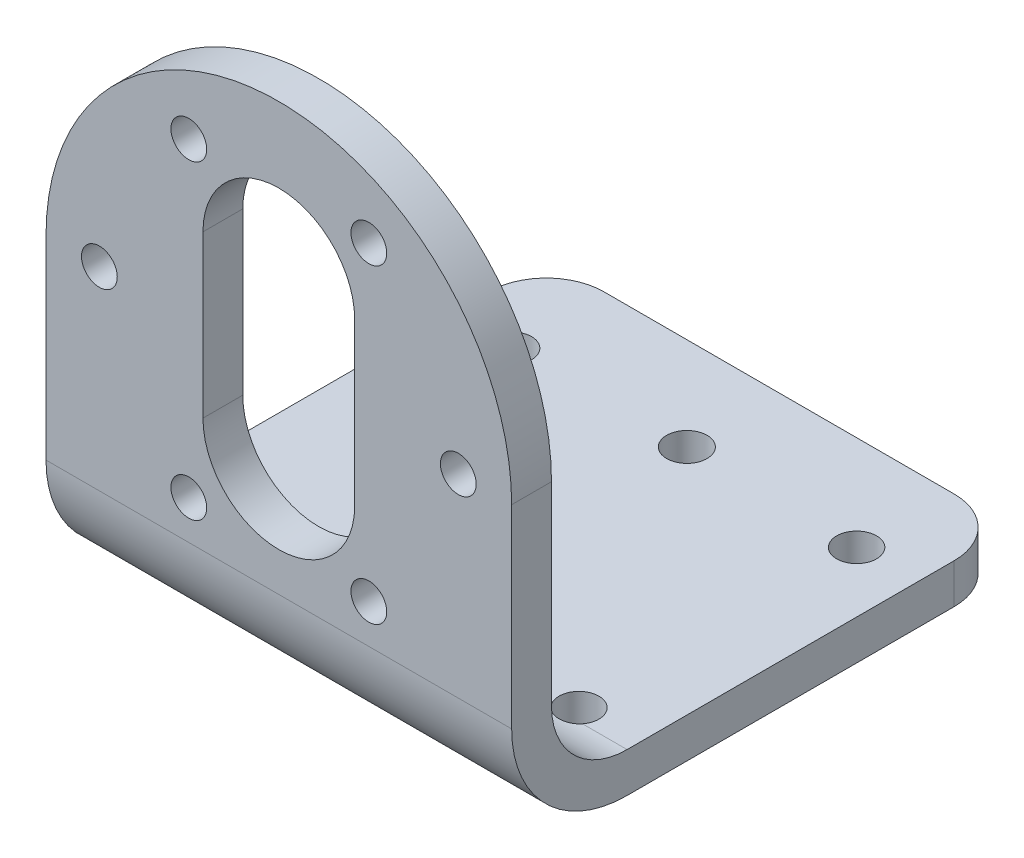
ISO-10303-21;
HEADER;
FILE_DESCRIPTION(('STEP AP214'),'2;1');
FILE_NAME('part.step','',(''),(''),'','','');
FILE_SCHEMA(('AUTOMOTIVE_DESIGN { 1 0 10303 214 1 1 1 1 }'));
ENDSEC;
DATA;
#1=APPLICATION_CONTEXT('core data for automotive mechanical design processes');
#2=APPLICATION_PROTOCOL_DEFINITION('international standard','automotive_design',2000,#1);
#3=PRODUCT_CONTEXT('',#1,'mechanical');
#4=PRODUCT('Part','Part','',(#3));
#5=PRODUCT_RELATED_PRODUCT_CATEGORY('part','',(#4));
#6=PRODUCT_DEFINITION_FORMATION('','',#4);
#7=PRODUCT_DEFINITION_CONTEXT('part definition',#1,'design');
#8=PRODUCT_DEFINITION('design','',#6,#7);
#9=PRODUCT_DEFINITION_SHAPE('','',#8);
#10=(LENGTH_UNIT() NAMED_UNIT(*) SI_UNIT(.MILLI.,.METRE.));
#11=(NAMED_UNIT(*) PLANE_ANGLE_UNIT() SI_UNIT($,.RADIAN.));
#12=(NAMED_UNIT(*) SI_UNIT($,.STERADIAN.) SOLID_ANGLE_UNIT());
#13=UNCERTAINTY_MEASURE_WITH_UNIT(LENGTH_MEASURE(1.E-05),#10,'distance_accuracy_value','');
#14=(GEOMETRIC_REPRESENTATION_CONTEXT(3) GLOBAL_UNCERTAINTY_ASSIGNED_CONTEXT((#13)) GLOBAL_UNIT_ASSIGNED_CONTEXT((#10,
#11,#12)) REPRESENTATION_CONTEXT('',''));
#15=CARTESIAN_POINT('',(0.,0.,0.));
#16=DIRECTION('',(0.,0.,1.));
#17=DIRECTION('',(1.,0.,0.));
#18=AXIS2_PLACEMENT_3D('',#15,#16,#17);
#19=CARTESIAN_POINT('',(-47.1412127925836,47.,50.783023222912));
#20=DIRECTION('',(0.,0.,-1.));
#21=DIRECTION('',(-1.,0.,0.));
#22=AXIS2_PLACEMENT_3D('',#19,#20,#21);
#23=PLANE('',#22);
#24=CARTESIAN_POINT('',(-19.1662127925836,13.3727697016443,50.783023222912));
#25=DIRECTION('',(0.,0.,1.));
#26=DIRECTION('',(1.,0.,0.));
#27=AXIS2_PLACEMENT_3D('',#24,#25,#26);
#28=CIRCLE('',#27,1.55);
#29=CARTESIAN_POINT('',(-17.6162127925836,13.3727697016443,50.783023222912));
#30=VERTEX_POINT('',#29);
#31=EDGE_CURVE('E513',#30,#30,#28,.F.);
#32=ORIENTED_EDGE('',*,*,#31,.T.);
#33=EDGE_LOOP('',(#32));
#34=FACE_BOUND('',#33,.T.);
#35=CARTESIAN_POINT('',(-42.5162127925836,26.825,50.783023222912));
#36=DIRECTION('',(0.,0.,1.));
#37=DIRECTION('',(1.,0.,0.));
#38=AXIS2_PLACEMENT_3D('',#35,#36,#37);
#39=CIRCLE('',#38,1.54999999999999);
#40=CARTESIAN_POINT('',(-40.9662127925836,26.825,50.783023222912));
#41=VERTEX_POINT('',#40);
#42=EDGE_CURVE('E521',#41,#41,#39,.T.);
#43=ORIENTED_EDGE('',*,*,#42,.F.);
#44=EDGE_LOOP('',(#43));
#45=FACE_BOUND('',#44,.T.);
#46=CARTESIAN_POINT('',(-19.1662127925836,40.2772302983557,50.783023222912));
#47=DIRECTION('',(0.,0.,1.));
#48=DIRECTION('',(1.,0.,0.));
#49=AXIS2_PLACEMENT_3D('',#46,#47,#48);
#50=CIRCLE('',#49,1.55);
#51=CARTESIAN_POINT('',(-17.6162127925836,40.2772302983557,50.783023222912));
#52=VERTEX_POINT('',#51);
#53=EDGE_CURVE('E505',#52,#52,#50,.T.);
#54=ORIENTED_EDGE('',*,*,#53,.F.);
#55=EDGE_LOOP('',(#54));
#56=FACE_BOUND('',#55,.T.);
#57=CARTESIAN_POINT('',(-34.7662127925836,13.3727697016443,50.783023222912));
#58=DIRECTION('',(0.,0.,1.));
#59=DIRECTION('',(1.,0.,0.));
#60=AXIS2_PLACEMENT_3D('',#57,#58,#59);
#61=CIRCLE('',#60,1.55);
#62=CARTESIAN_POINT('',(-33.2162127925836,13.3727697016443,50.783023222912));
#63=VERTEX_POINT('',#62);
#64=EDGE_CURVE('E296',#63,#63,#61,.F.);
#65=ORIENTED_EDGE('',*,*,#64,.T.);
#66=EDGE_LOOP('',(#65));
#67=FACE_BOUND('',#66,.T.);
#68=CARTESIAN_POINT('',(-26.9662127925836,19.945,50.783023222912));
#69=DIRECTION('',(0.,0.,1.));
#70=DIRECTION('',(1.,0.,0.));
#71=AXIS2_PLACEMENT_3D('',#68,#69,#70);
#72=CIRCLE('',#71,6.575);
#73=CARTESIAN_POINT('',(-33.5412127925836,19.945,50.783023222912));
#74=VERTEX_POINT('',#73);
#75=CARTESIAN_POINT('',(-20.3912127925836,19.945,50.783023222912));
#76=VERTEX_POINT('',#75);
#77=EDGE_CURVE('E188',#74,#76,#72,.T.);
#78=ORIENTED_EDGE('',*,*,#77,.F.);
#79=DIRECTION('',(0.,-1.,0.));
#80=VECTOR('',#79,1.);
#81=CARTESIAN_POINT('',(-33.5412127925836,0.,50.783023222912));
#82=LINE('',#81,#80);
#83=CARTESIAN_POINT('',(-33.5412127925836,33.925,50.783023222912));
#84=VERTEX_POINT('',#83);
#85=EDGE_CURVE('E65',#84,#74,#82,.T.);
#86=ORIENTED_EDGE('',*,*,#85,.F.);
#87=CARTESIAN_POINT('',(-26.9662127925836,33.925,50.783023222912));
#88=DIRECTION('',(0.,0.,1.));
#89=DIRECTION('',(1.,0.,0.));
#90=AXIS2_PLACEMENT_3D('',#87,#88,#89);
#91=CIRCLE('',#90,6.57500000000001);
#92=CARTESIAN_POINT('',(-20.3912127925836,33.925,50.783023222912));
#93=VERTEX_POINT('',#92);
#94=EDGE_CURVE('E195',#93,#84,#91,.T.);
#95=ORIENTED_EDGE('',*,*,#94,.F.);
#96=DIRECTION('',(0.,-1.,0.));
#97=VECTOR('',#96,1.);
#98=CARTESIAN_POINT('',(-20.3912127925836,0.,50.783023222912));
#99=LINE('',#98,#97);
#100=EDGE_CURVE('E178',#93,#76,#99,.T.);
#101=ORIENTED_EDGE('',*,*,#100,.T.);
#102=EDGE_LOOP('',(#78,#86,#95,#101));
#103=FACE_BOUND('',#102,.T.);
#104=DIRECTION('',(0.,-1.,0.));
#105=VECTOR('',#104,1.);
#106=CARTESIAN_POINT('',(-47.1412127925836,47.,50.783023222912));
#107=LINE('',#106,#105);
#108=CARTESIAN_POINT('',(-47.1412127925836,26.825,50.783023222912));
#109=VERTEX_POINT('',#108);
#110=CARTESIAN_POINT('',(-47.1412127925836,10.,50.783023222912));
#111=VERTEX_POINT('',#110);
#112=EDGE_CURVE('E377',#109,#111,#107,.T.);
#113=ORIENTED_EDGE('',*,*,#112,.T.);
#114=DIRECTION('',(1.,0.,0.));
#115=VECTOR('',#114,1.);
#116=CARTESIAN_POINT('',(-47.1412127925836,10.,50.783023222912));
#117=LINE('',#116,#115);
#118=CARTESIAN_POINT('',(-6.79121279258359,10.,50.783023222912));
#119=VERTEX_POINT('',#118);
#120=EDGE_CURVE('E370',#111,#119,#117,.T.);
#121=ORIENTED_EDGE('',*,*,#120,.T.);
#122=DIRECTION('',(0.,-1.,0.));
#123=VECTOR('',#122,1.);
#124=CARTESIAN_POINT('',(-6.79121279258359,47.,50.783023222912));
#125=LINE('',#124,#123);
#126=CARTESIAN_POINT('',(-6.79121279258359,26.825,50.783023222912));
#127=VERTEX_POINT('',#126);
#128=EDGE_CURVE('E381',#127,#119,#125,.T.);
#129=ORIENTED_EDGE('',*,*,#128,.F.);
#130=CARTESIAN_POINT('',(-26.9662127925836,26.825,50.783023222912));
#131=DIRECTION('',(0.,0.,1.));
#132=DIRECTION('',(1.,0.,0.));
#133=AXIS2_PLACEMENT_3D('',#130,#131,#132);
#134=CIRCLE('',#133,20.175);
#135=EDGE_CURVE('E400',#127,#109,#134,.T.);
#136=ORIENTED_EDGE('',*,*,#135,.T.);
#137=EDGE_LOOP('',(#113,#121,#129,#136));
#138=FACE_BOUND('',#137,.T.);
#139=CARTESIAN_POINT('',(-34.7662127925836,40.2772302983557,50.783023222912));
#140=DIRECTION('',(0.,0.,1.));
#141=DIRECTION('',(1.,0.,0.));
#142=AXIS2_PLACEMENT_3D('',#139,#140,#141);
#143=CIRCLE('',#142,1.55);
#144=CARTESIAN_POINT('',(-33.2162127925836,40.2772302983557,50.783023222912));
#145=VERTEX_POINT('',#144);
#146=EDGE_CURVE('E509',#145,#145,#143,.T.);
#147=ORIENTED_EDGE('',*,*,#146,.F.);
#148=EDGE_LOOP('',(#147));
#149=FACE_BOUND('',#148,.T.);
#150=CARTESIAN_POINT('',(-11.4162127925836,26.825,50.783023222912));
#151=DIRECTION('',(0.,0.,1.));
#152=DIRECTION('',(1.,0.,0.));
#153=AXIS2_PLACEMENT_3D('',#150,#151,#152);
#154=CIRCLE('',#153,1.55);
#155=CARTESIAN_POINT('',(-9.8662127925836,26.825,50.783023222912));
#156=VERTEX_POINT('',#155);
#157=EDGE_CURVE('E517',#156,#156,#154,.T.);
#158=ORIENTED_EDGE('',*,*,#157,.F.);
#159=EDGE_LOOP('',(#158));
#160=FACE_BOUND('',#159,.T.);
#161=ADVANCED_FACE('F47',(#34,#45,#56,#67,#103,#138,#149,#160),#23,.F.);
#162=CARTESIAN_POINT('',(54.8587872074164,0.,47.3330232229119));
#163=DIRECTION('',(0.,0.,1.));
#164=DIRECTION('',(1.,0.,0.));
#165=AXIS2_PLACEMENT_3D('',#162,#163,#164);
#166=PLANE('',#165);
#167=CARTESIAN_POINT('',(-19.1662127925836,13.3727697016443,47.333023222912));
#168=DIRECTION('',(0.,0.,1.));
#169=DIRECTION('',(1.,0.,0.));
#170=AXIS2_PLACEMENT_3D('',#167,#168,#169);
#171=CIRCLE('',#170,1.55);
#172=CARTESIAN_POINT('',(-17.6162127925836,13.3727697016443,47.333023222912));
#173=VERTEX_POINT('',#172);
#174=EDGE_CURVE('E258',#173,#173,#171,.F.);
#175=ORIENTED_EDGE('',*,*,#174,.F.);
#176=EDGE_LOOP('',(#175));
#177=FACE_BOUND('',#176,.T.);
#178=CARTESIAN_POINT('',(-42.5162127925836,26.825,47.333023222912));
#179=DIRECTION('',(0.,0.,1.));
#180=DIRECTION('',(1.,0.,0.));
#181=AXIS2_PLACEMENT_3D('',#178,#179,#180);
#182=CIRCLE('',#181,1.54999999999999);
#183=CARTESIAN_POINT('',(-40.9662127925836,26.825,47.333023222912));
#184=VERTEX_POINT('',#183);
#185=EDGE_CURVE('E262',#184,#184,#182,.T.);
#186=ORIENTED_EDGE('',*,*,#185,.T.);
#187=EDGE_LOOP('',(#186));
#188=FACE_BOUND('',#187,.T.);
#189=CARTESIAN_POINT('',(-19.1662127925836,40.2772302983557,47.333023222912));
#190=DIRECTION('',(0.,0.,1.));
#191=DIRECTION('',(1.,0.,0.));
#192=AXIS2_PLACEMENT_3D('',#189,#190,#191);
#193=CIRCLE('',#192,1.55);
#194=CARTESIAN_POINT('',(-17.6162127925836,40.2772302983557,47.333023222912));
#195=VERTEX_POINT('',#194);
#196=EDGE_CURVE('E266',#195,#195,#193,.T.);
#197=ORIENTED_EDGE('',*,*,#196,.T.);
#198=EDGE_LOOP('',(#197));
#199=FACE_BOUND('',#198,.T.);
#200=CARTESIAN_POINT('',(-34.7662127925836,13.3727697016443,47.333023222912));
#201=DIRECTION('',(0.,0.,1.));
#202=DIRECTION('',(1.,0.,0.));
#203=AXIS2_PLACEMENT_3D('',#200,#201,#202);
#204=CIRCLE('',#203,1.55);
#205=CARTESIAN_POINT('',(-33.2162127925836,13.3727697016443,47.333023222912));
#206=VERTEX_POINT('',#205);
#207=EDGE_CURVE('E270',#206,#206,#204,.F.);
#208=ORIENTED_EDGE('',*,*,#207,.F.);
#209=EDGE_LOOP('',(#208));
#210=FACE_BOUND('',#209,.T.);
#211=CARTESIAN_POINT('',(-26.9662127925836,33.925,47.333023222912));
#212=DIRECTION('',(0.,0.,1.));
#213=DIRECTION('',(1.,0.,0.));
#214=AXIS2_PLACEMENT_3D('',#211,#212,#213);
#215=CIRCLE('',#214,6.57500000000001);
#216=CARTESIAN_POINT('',(-20.3912127925836,33.925,47.333023222912));
#217=VERTEX_POINT('',#216);
#218=CARTESIAN_POINT('',(-33.5412127925836,33.925,47.333023222912));
#219=VERTEX_POINT('',#218);
#220=EDGE_CURVE('E57',#217,#219,#215,.T.);
#221=ORIENTED_EDGE('',*,*,#220,.T.);
#222=DIRECTION('',(0.,-1.,0.));
#223=VECTOR('',#222,1.);
#224=CARTESIAN_POINT('',(-33.5412127925836,0.,47.333023222912));
#225=LINE('',#224,#223);
#226=CARTESIAN_POINT('',(-33.5412127925836,19.945,47.333023222912));
#227=VERTEX_POINT('',#226);
#228=EDGE_CURVE('E11',#219,#227,#225,.T.);
#229=ORIENTED_EDGE('',*,*,#228,.T.);
#230=CARTESIAN_POINT('',(-26.9662127925836,19.945,47.333023222912));
#231=DIRECTION('',(0.,0.,1.));
#232=DIRECTION('',(1.,0.,0.));
#233=AXIS2_PLACEMENT_3D('',#230,#231,#232);
#234=CIRCLE('',#233,6.575);
#235=CARTESIAN_POINT('',(-20.3912127925836,19.945,47.333023222912));
#236=VERTEX_POINT('',#235);
#237=EDGE_CURVE('E302',#227,#236,#234,.T.);
#238=ORIENTED_EDGE('',*,*,#237,.T.);
#239=DIRECTION('',(0.,-1.,0.));
#240=VECTOR('',#239,1.);
#241=CARTESIAN_POINT('',(-20.3912127925836,0.,47.333023222912));
#242=LINE('',#241,#240);
#243=EDGE_CURVE('E181',#217,#236,#242,.T.);
#244=ORIENTED_EDGE('',*,*,#243,.F.);
#245=EDGE_LOOP('',(#221,#229,#238,#244));
#246=FACE_BOUND('',#245,.T.);
#247=DIRECTION('',(-1.,0.,0.));
#248=VECTOR('',#247,1.);
#249=CARTESIAN_POINT('',(54.8587872074164,10.,47.3330232229119));
#250=LINE('',#249,#248);
#251=CARTESIAN_POINT('',(-6.79121279258359,10.,47.333023222912));
#252=VERTEX_POINT('',#251);
#253=CARTESIAN_POINT('',(-47.1412127925836,10.,47.333023222912));
#254=VERTEX_POINT('',#253);
#255=EDGE_CURVE('E275',#252,#254,#250,.T.);
#256=ORIENTED_EDGE('',*,*,#255,.T.);
#257=DIRECTION('',(0.,1.,0.));
#258=VECTOR('',#257,1.);
#259=CARTESIAN_POINT('',(-47.1412127925836,0.,47.333023222912));
#260=LINE('',#259,#258);
#261=CARTESIAN_POINT('',(-47.1412127925836,26.825,47.333023222912));
#262=VERTEX_POINT('',#261);
#263=EDGE_CURVE('E424',#254,#262,#260,.T.);
#264=ORIENTED_EDGE('',*,*,#263,.T.);
#265=CARTESIAN_POINT('',(-26.9662127925836,26.825,47.333023222912));
#266=DIRECTION('',(0.,0.,1.));
#267=DIRECTION('',(1.,0.,0.));
#268=AXIS2_PLACEMENT_3D('',#265,#266,#267);
#269=CIRCLE('',#268,20.175);
#270=CARTESIAN_POINT('',(-6.79121279258359,26.825,47.333023222912));
#271=VERTEX_POINT('',#270);
#272=EDGE_CURVE('E355',#262,#271,#269,.F.);
#273=ORIENTED_EDGE('',*,*,#272,.T.);
#274=DIRECTION('',(0.,1.,0.));
#275=VECTOR('',#274,1.);
#276=CARTESIAN_POINT('',(-6.7912127925836,47.,47.333023222912));
#277=LINE('',#276,#275);
#278=EDGE_CURVE('E408',#252,#271,#277,.T.);
#279=ORIENTED_EDGE('',*,*,#278,.F.);
#280=EDGE_LOOP('',(#256,#264,#273,#279));
#281=FACE_BOUND('',#280,.T.);
#282=CARTESIAN_POINT('',(-34.7662127925836,40.2772302983557,47.333023222912));
#283=DIRECTION('',(0.,0.,1.));
#284=DIRECTION('',(1.,0.,0.));
#285=AXIS2_PLACEMENT_3D('',#282,#283,#284);
#286=CIRCLE('',#285,1.55);
#287=CARTESIAN_POINT('',(-33.2162127925836,40.2772302983557,47.333023222912));
#288=VERTEX_POINT('',#287);
#289=EDGE_CURVE('E280',#288,#288,#286,.T.);
#290=ORIENTED_EDGE('',*,*,#289,.T.);
#291=EDGE_LOOP('',(#290));
#292=FACE_BOUND('',#291,.T.);
#293=CARTESIAN_POINT('',(-11.4162127925836,26.825,47.333023222912));
#294=DIRECTION('',(0.,0.,1.));
#295=DIRECTION('',(1.,0.,0.));
#296=AXIS2_PLACEMENT_3D('',#293,#294,#295);
#297=CIRCLE('',#296,1.55);
#298=CARTESIAN_POINT('',(-9.8662127925836,26.825,47.333023222912));
#299=VERTEX_POINT('',#298);
#300=EDGE_CURVE('E283',#299,#299,#297,.T.);
#301=ORIENTED_EDGE('',*,*,#300,.T.);
#302=EDGE_LOOP('',(#301));
#303=FACE_BOUND('',#302,.T.);
#304=ADVANCED_FACE('F244',(#177,#188,#199,#210,#246,#281,#292,#303),#166,.F.);
#305=CARTESIAN_POINT('',(-47.1412127925836,10.,40.783023222912));
#306=DIRECTION('',(1.,0.,0.));
#307=DIRECTION('',(0.,0.,-1.));
#308=AXIS2_PLACEMENT_3D('',#305,#306,#307);
#309=CYLINDRICAL_SURFACE('',#308,10.);
#310=DIRECTION('',(1.,0.,0.));
#311=VECTOR('',#310,1.);
#312=CARTESIAN_POINT('',(0.,0.,40.783023222912));
#313=LINE('',#312,#311);
#314=CARTESIAN_POINT('',(-43.2784362563963,0.,40.783023222912));
#315=VERTEX_POINT('',#314);
#316=CARTESIAN_POINT('',(-47.1412127925836,0.,40.783023222912));
#317=VERTEX_POINT('',#316);
#318=EDGE_CURVE('E366',#315,#317,#313,.F.);
#319=ORIENTED_EDGE('',*,*,#318,.F.);
#320=CARTESIAN_POINT('',(-43.2784362563963,0.,40.783023222912));
#321=CARTESIAN_POINT('',(-43.2486359399709,-4.4349836473621E-07,40.8214603242163));
#322=CARTESIAN_POINT('',(-43.2172287872784,0.000221662332903279,40.8586212397988));
#323=CARTESIAN_POINT('',(-43.1514043101819,0.0010186956629008,40.9301644796071));
#324=CARTESIAN_POINT('',(-43.1169872222953,0.00159359546079015,40.9645470217466));
#325=CARTESIAN_POINT('',(-43.0096338534374,0.00370689110784972,41.0630910128974));
#326=CARTESIAN_POINT('',(-42.9324984911893,0.0056344754400285,41.1227736432645));
#327=CARTESIAN_POINT('',(-42.7693296609276,0.00977993356184888,41.228345263273));
#328=CARTESIAN_POINT('',(-42.6832930344563,0.0119979104668324,41.2742293340198));
#329=CARTESIAN_POINT('',(-42.5047417406216,0.0160643864272017,41.3509225745123));
#330=CARTESIAN_POINT('',(-42.4122283105362,0.017912955792662,41.3817346145671));
#331=CARTESIAN_POINT('',(-42.2232265987625,0.0207581801391745,41.4274329016619));
#332=CARTESIAN_POINT('',(-42.12673395157,0.0217538719032161,41.4423011469684));
#333=CARTESIAN_POINT('',(-41.9326057116994,0.0226429764720122,41.4556247462691));
#334=CARTESIAN_POINT('',(-41.8349700052027,0.0225362785590523,41.4540784516805));
#335=CARTESIAN_POINT('',(-41.6415763854825,0.021247958445125,41.4346366721685));
#336=CARTESIAN_POINT('',(-41.545814678288,0.0200688027684255,41.4167787017401));
#337=CARTESIAN_POINT('',(-41.3586275956189,0.0169319205563948,41.3652693387677));
#338=CARTESIAN_POINT('',(-41.2672030897992,0.0149740386105347,41.3316147934571));
#339=CARTESIAN_POINT('',(-41.0911541003926,0.0107972095030289,41.24941231941));
#340=CARTESIAN_POINT('',(-41.0065411024623,0.0085778363148311,41.2008398734209));
#341=CARTESIAN_POINT('',(-40.8467183970987,0.00456685197800229,41.0901995387781));
#342=CARTESIAN_POINT('',(-40.7714972938275,0.0027747199777472,41.0281482605263));
#343=CARTESIAN_POINT('',(-40.6737041799865,0.00108006920567029,40.9325906426761));
#344=CARTESIAN_POINT('',(-40.6463021380582,0.000686824269006335,40.9039027447807));
#345=CARTESIAN_POINT('',(-40.5935784639084,0.000146949433395791,40.8447642573952));
#346=CARTESIAN_POINT('',(-40.5682532244093,-1.17077590246397E-07,40.8143168878988));
#347=CARTESIAN_POINT('',(-40.5439893287709,0.,40.783023222912));
#348=B_SPLINE_CURVE_WITH_KNOTS('',3,(#320,#321,#322,#323,#324,#325,#326,#327,#328,#329,#330,
#331,#332,#333,#334,#335,#336,#337,#338,#339,#340,#341,#342,#343,#344,#345,#346,#347),
.UNSPECIFIED.,.F.,.F.,(4,2,2,2,2,2,2,2,2,2,2,2,2,4),(0.,0.145817200628919,0.291622953380003,
0.5827663273497,0.874013365077776,1.1652049162671,1.45672489938087,1.74827416137905,
2.03915458593045,2.33009309068699,2.62151232879096,2.91257445855667,3.03152037022583,
3.1502550998775),.UNSPECIFIED.);
#349=CARTESIAN_POINT('',(-40.5439893287709,0.,40.783023222912));
#350=VERTEX_POINT('',#349);
#351=EDGE_CURVE('E433',#315,#350,#348,.T.);
#352=ORIENTED_EDGE('',*,*,#351,.T.);
#353=CARTESIAN_POINT('',(-13.3884362563963,0.,40.783023222912));
#354=VERTEX_POINT('',#353);
#355=EDGE_CURVE('E365',#354,#350,#313,.F.);
#356=ORIENTED_EDGE('',*,*,#355,.F.);
#357=CARTESIAN_POINT('',(-13.3884362563963,0.,40.783023222912));
#358=CARTESIAN_POINT('',(-13.3586359399709,-4.43498364004496E-07,40.8214603242163));
#359=CARTESIAN_POINT('',(-13.3272287872784,0.000221662332904452,40.8586212397988));
#360=CARTESIAN_POINT('',(-13.261404310182,0.0010186956629024,40.9301644796071));
#361=CARTESIAN_POINT('',(-13.2269872222954,0.00159359546079172,40.9645470217466));
#362=CARTESIAN_POINT('',(-13.1196338534375,0.00370689110785085,41.0630910128974));
#363=CARTESIAN_POINT('',(-13.0424984911893,0.00563447544002885,41.1227736432645));
#364=CARTESIAN_POINT('',(-12.8793296609276,0.00977993356184872,41.228345263273));
#365=CARTESIAN_POINT('',(-12.7932930344563,0.0119979104668325,41.2742293340198));
#366=CARTESIAN_POINT('',(-12.6147417406216,0.016064386427203,41.3509225745122));
#367=CARTESIAN_POINT('',(-12.5222283105362,0.0179129557926641,41.3817346145671));
#368=CARTESIAN_POINT('',(-12.3332265987625,0.0207581801391763,41.4274329016619));
#369=CARTESIAN_POINT('',(-12.23673395157,0.0217538719032167,41.4423011469684));
#370=CARTESIAN_POINT('',(-12.0426057116995,0.0226429764720127,41.4556247462691));
#371=CARTESIAN_POINT('',(-11.9449700052027,0.022536278559054,41.4540784516805));
#372=CARTESIAN_POINT('',(-11.7515763854825,0.0212479584451273,41.4346366721685));
#373=CARTESIAN_POINT('',(-11.655814678288,0.0200688027684272,41.4167787017401));
#374=CARTESIAN_POINT('',(-11.4686275956189,0.0169319205563954,41.3652693387677));
#375=CARTESIAN_POINT('',(-11.3772030897992,0.0149740386105346,41.3316147934571));
#376=CARTESIAN_POINT('',(-11.2011541003926,0.0107972095030294,41.24941231941));
#377=CARTESIAN_POINT('',(-11.1165411024623,0.00857783631483298,41.2008398734209));
#378=CARTESIAN_POINT('',(-10.9567183970987,0.00456685197800412,41.0901995387781));
#379=CARTESIAN_POINT('',(-10.8814972938275,0.00277471997774761,41.0281482605263));
#380=CARTESIAN_POINT('',(-10.7837041799865,0.00108006920567024,40.9325906426761));
#381=CARTESIAN_POINT('',(-10.7563021380582,0.00068682426900633,40.9039027447807));
#382=CARTESIAN_POINT('',(-10.7035784639084,0.000146949433395858,40.8447642573952));
#383=CARTESIAN_POINT('',(-10.6782532244093,-1.17077590163831E-07,40.8143168878988));
#384=CARTESIAN_POINT('',(-10.6539893287709,0.,40.783023222912));
#385=B_SPLINE_CURVE_WITH_KNOTS('',3,(#357,#358,#359,#360,#361,#362,#363,#364,#365,#366,#367,
#368,#369,#370,#371,#372,#373,#374,#375,#376,#377,#378,#379,#380,#381,#382,#383,#384),
.UNSPECIFIED.,.F.,.F.,(4,2,2,2,2,2,2,2,2,2,2,2,2,4),(0.,0.145817200628917,0.29162295337999,
0.582766327349691,0.874013365077768,1.16520491626709,1.45672489938085,1.74827416137904,
2.03915458593043,2.33009309068698,2.62151232879094,2.91257445855666,3.03152037022582,
3.1502550998775),.UNSPECIFIED.);
#386=CARTESIAN_POINT('',(-10.6539893287709,0.,40.783023222912));
#387=VERTEX_POINT('',#386);
#388=EDGE_CURVE('E218',#354,#387,#385,.T.);
#389=ORIENTED_EDGE('',*,*,#388,.T.);
#390=CARTESIAN_POINT('',(-6.7912127925836,0.,40.783023222912));
#391=VERTEX_POINT('',#390);
#392=EDGE_CURVE('E361',#391,#387,#313,.F.);
#393=ORIENTED_EDGE('',*,*,#392,.F.);
#394=CARTESIAN_POINT('',(-6.79121279258359,10.,40.783023222912));
#395=DIRECTION('',(-1.,0.,0.));
#396=DIRECTION('',(0.,0.,1.));
#397=AXIS2_PLACEMENT_3D('',#394,#395,#396);
#398=CIRCLE('',#397,10.);
#399=EDGE_CURVE('E367',#119,#391,#398,.F.);
#400=ORIENTED_EDGE('',*,*,#399,.F.);
#401=ORIENTED_EDGE('',*,*,#120,.F.);
#402=CARTESIAN_POINT('',(-47.1412127925836,10.,40.783023222912));
#403=DIRECTION('',(1.,0.,0.));
#404=DIRECTION('',(0.,0.,-1.));
#405=AXIS2_PLACEMENT_3D('',#402,#403,#404);
#406=CIRCLE('',#405,10.);
#407=EDGE_CURVE('E358',#317,#111,#406,.F.);
#408=ORIENTED_EDGE('',*,*,#407,.F.);
#409=EDGE_LOOP('',(#319,#352,#356,#389,#393,#400,#401,#408));
#410=FACE_BOUND('',#409,.T.);
#411=ADVANCED_FACE('F246',(#410),#309,.T.);
#412=CARTESIAN_POINT('',(54.8587872074164,10.,40.783023222912));
#413=DIRECTION('',(-1.,0.,0.));
#414=DIRECTION('',(0.,0.,1.));
#415=AXIS2_PLACEMENT_3D('',#412,#413,#414);
#416=CYLINDRICAL_SURFACE('',#415,6.55);
#417=CARTESIAN_POINT('',(-43.2784362563963,3.45,40.783023222912));
#418=CARTESIAN_POINT('',(-43.2486649030444,3.44999934867349,40.8214232101327));
#419=CARTESIAN_POINT('',(-43.2172902209575,3.45033775649313,40.8585485309627));
#420=CARTESIAN_POINT('',(-43.1515404880796,3.45155234711172,40.9300223959799));
#421=CARTESIAN_POINT('',(-43.1171657950523,3.4524284658614,40.9643712703312));
#422=CARTESIAN_POINT('',(-43.0099569119221,3.4556495514347,41.0628179147159));
#423=CARTESIAN_POINT('',(-42.9329391434865,3.45858816576504,41.1224428225017));
#424=CARTESIAN_POINT('',(-42.7700443143619,3.46491250386588,41.2279283458496));
#425=CARTESIAN_POINT('',(-42.6841653050849,3.46829832602347,41.2737859252697));
#426=CARTESIAN_POINT('',(-42.5059278443798,3.47451325501785,41.3504810031661));
#427=CARTESIAN_POINT('',(-42.4135705615224,3.47734246191005,41.3813212025926));
#428=CARTESIAN_POINT('',(-42.2247208263061,3.48170828002287,41.4271593411075));
#429=CARTESIAN_POINT('',(-42.1282182748401,3.48324152138179,41.4421160044016));
#430=CARTESIAN_POINT('',(-41.9340504787137,3.48461989976377,41.4556076068657));
#431=CARTESIAN_POINT('',(-41.8363851496024,3.48446491341682,41.4541413459035));
#432=CARTESIAN_POINT('',(-41.6432092488083,3.48251007467015,41.4348786711695));
#433=CARTESIAN_POINT('',(-41.5476901567274,3.48071871713345,41.4171665920683));
#434=CARTESIAN_POINT('',(-41.360958528036,3.47594847703818,41.3660360946161));
#435=CARTESIAN_POINT('',(-41.2697470123892,3.47296931451527,41.3326139730928));
#436=CARTESIAN_POINT('',(-41.0939340886157,3.4666029712209,41.2508939730243));
#437=CARTESIAN_POINT('',(-41.0093543826965,3.46321453608974,41.2025496178487));
#438=CARTESIAN_POINT('',(-40.8495367810102,3.45707866045226,41.0923795263331));
#439=CARTESIAN_POINT('',(-40.7742873177906,3.45433042244906,41.0305707505484));
#440=CARTESIAN_POINT('',(-40.6759167088539,3.45169993130762,40.9348709782518));
#441=CARTESIAN_POINT('',(-40.6480286032222,3.45108135877871,40.9057707295625));
#442=CARTESIAN_POINT('',(-40.5943938538111,3.45023162529874,40.8457439712088));
#443=CARTESIAN_POINT('',(-40.5686436235682,3.44999980253179,40.814820675295));
#444=CARTESIAN_POINT('',(-40.5439893287709,3.45,40.783023222912));
#445=B_SPLINE_CURVE_WITH_KNOTS('',3,(#417,#418,#419,#420,#421,#422,#423,#424,#425,#426,#427,
#428,#429,#430,#431,#432,#433,#434,#435,#436,#437,#438,#439,#440,#441,#442,#443,#444),
.UNSPECIFIED.,.F.,.F.,(4,2,2,2,2,2,2,2,2,2,2,2,2,4),(0.,0.145674126204746,0.291330903847856,
0.582167706488014,0.873068601032213,1.16391715626718,1.45551969013826,1.74714353348516,
2.03726202612376,2.32744893983427,2.61854894557612,2.90928436386592,3.03013527599317,
3.15077917208322),.UNSPECIFIED.);
#446=CARTESIAN_POINT('',(-43.2784362563963,3.44999999999999,40.783023222912));
#447=VERTEX_POINT('',#446);
#448=CARTESIAN_POINT('',(-40.5439893287709,3.44999999999999,40.783023222912));
#449=VERTEX_POINT('',#448);
#450=EDGE_CURVE('E441',#447,#449,#445,.T.);
#451=ORIENTED_EDGE('',*,*,#450,.F.);
#452=DIRECTION('',(-1.,0.,0.));
#453=VECTOR('',#452,1.);
#454=CARTESIAN_POINT('',(54.8587872074164,3.45,40.783023222912));
#455=LINE('',#454,#453);
#456=CARTESIAN_POINT('',(-47.1412127925836,3.45,40.783023222912));
#457=VERTEX_POINT('',#456);
#458=EDGE_CURVE('E415',#447,#457,#455,.T.);
#459=ORIENTED_EDGE('',*,*,#458,.T.);
#460=CARTESIAN_POINT('',(-47.1412127925836,10.,40.783023222912));
#461=DIRECTION('',(-1.,0.,0.));
#462=DIRECTION('',(0.,0.,1.));
#463=AXIS2_PLACEMENT_3D('',#460,#461,#462);
#464=CIRCLE('',#463,6.55);
#465=EDGE_CURVE('E427',#457,#254,#464,.T.);
#466=ORIENTED_EDGE('',*,*,#465,.T.);
#467=ORIENTED_EDGE('',*,*,#255,.F.);
#468=CARTESIAN_POINT('',(-6.79121279258359,10.,40.783023222912));
#469=DIRECTION('',(-1.,0.,0.));
#470=DIRECTION('',(0.,0.,1.));
#471=AXIS2_PLACEMENT_3D('',#468,#469,#470);
#472=CIRCLE('',#471,6.55);
#473=CARTESIAN_POINT('',(-6.7912127925836,3.45,40.783023222912));
#474=VERTEX_POINT('',#473);
#475=EDGE_CURVE('E351',#474,#252,#472,.T.);
#476=ORIENTED_EDGE('',*,*,#475,.F.);
#477=CARTESIAN_POINT('',(-10.6539893287709,3.44999999999999,40.783023222912));
#478=VERTEX_POINT('',#477);
#479=EDGE_CURVE('E412',#474,#478,#455,.T.);
#480=ORIENTED_EDGE('',*,*,#479,.T.);
#481=CARTESIAN_POINT('',(-13.3884362563963,3.45,40.783023222912));
#482=CARTESIAN_POINT('',(-13.3586649030444,3.44999934867349,40.8214232101327));
#483=CARTESIAN_POINT('',(-13.3272902209575,3.45033775649313,40.8585485309627));
#484=CARTESIAN_POINT('',(-13.2615404880797,3.45155234711172,40.9300223959798));
#485=CARTESIAN_POINT('',(-13.2271657950523,3.4524284658614,40.9643712703311));
#486=CARTESIAN_POINT('',(-13.1199569119221,3.4556495514347,41.0628179147159));
#487=CARTESIAN_POINT('',(-13.0429391434865,3.45858816576504,41.1224428225017));
#488=CARTESIAN_POINT('',(-12.8800443143619,3.46491250386588,41.2279283458496));
#489=CARTESIAN_POINT('',(-12.7941653050849,3.46829832602347,41.2737859252697));
#490=CARTESIAN_POINT('',(-12.6159278443798,3.47451325501785,41.3504810031661));
#491=CARTESIAN_POINT('',(-12.5235705615224,3.47734246191005,41.3813212025926));
#492=CARTESIAN_POINT('',(-12.3347208263061,3.48170828002287,41.4271593411075));
#493=CARTESIAN_POINT('',(-12.2382182748401,3.48324152138179,41.4421160044016));
#494=CARTESIAN_POINT('',(-12.0440504787137,3.48461989976377,41.4556076068657));
#495=CARTESIAN_POINT('',(-11.9463851496024,3.48446491341683,41.4541413459035));
#496=CARTESIAN_POINT('',(-11.7532092488083,3.48251007467015,41.4348786711695));
#497=CARTESIAN_POINT('',(-11.6576901567275,3.48071871713346,41.4171665920683));
#498=CARTESIAN_POINT('',(-11.470958528036,3.47594847703818,41.3660360946161));
#499=CARTESIAN_POINT('',(-11.3797470123892,3.47296931451527,41.3326139730928));
#500=CARTESIAN_POINT('',(-11.2039340886157,3.4666029712209,41.2508939730243));
#501=CARTESIAN_POINT('',(-11.1193543826966,3.46321453608974,41.2025496178487));
#502=CARTESIAN_POINT('',(-10.9595367810102,3.45707866045226,41.0923795263331));
#503=CARTESIAN_POINT('',(-10.8842873177906,3.45433042244906,41.0305707505484));
#504=CARTESIAN_POINT('',(-10.7859167088539,3.45169993130762,40.9348709782518));
#505=CARTESIAN_POINT('',(-10.7580286032222,3.45108135877871,40.9057707295625));
#506=CARTESIAN_POINT('',(-10.7043938538111,3.45023162529874,40.8457439712088));
#507=CARTESIAN_POINT('',(-10.6786436235682,3.44999980253179,40.814820675295));
#508=CARTESIAN_POINT('',(-10.6539893287709,3.45,40.783023222912));
#509=B_SPLINE_CURVE_WITH_KNOTS('',3,(#481,#482,#483,#484,#485,#486,#487,#488,#489,#490,#491,
#492,#493,#494,#495,#496,#497,#498,#499,#500,#501,#502,#503,#504,#505,#506,#507,#508),
.UNSPECIFIED.,.F.,.F.,(4,2,2,2,2,2,2,2,2,2,2,2,2,4),(0.,0.145674126204736,0.291330903847846,
0.58216770648801,0.8730686010322,1.16391715626717,1.45551969013825,1.74714353348516,
2.03726202612376,2.32744893983427,2.61854894557612,2.90928436386591,3.03013527599317,
3.15077917208322),.UNSPECIFIED.);
#510=CARTESIAN_POINT('',(-13.3884362563963,3.44999999999999,40.783023222912));
#511=VERTEX_POINT('',#510);
#512=EDGE_CURVE('E205',#511,#478,#509,.T.);
#513=ORIENTED_EDGE('',*,*,#512,.F.);
#514=EDGE_CURVE('E420',#511,#449,#455,.T.);
#515=ORIENTED_EDGE('',*,*,#514,.T.);
#516=EDGE_LOOP('',(#451,#459,#466,#467,#476,#480,#513,#515));
#517=FACE_BOUND('',#516,.T.);
#518=ADVANCED_FACE('F225',(#517),#416,.F.);
#519=CARTESIAN_POINT('',(-47.1412127925836,47.,7.43302322291196));
#520=DIRECTION('',(0.,0.,1.));
#521=DIRECTION('',(1.,0.,0.));
#522=AXIS2_PLACEMENT_3D('',#519,#520,#521);
#523=PLANE('',#522);
#524=DIRECTION('',(1.,0.,0.));
#525=VECTOR('',#524,1.);
#526=CARTESIAN_POINT('',(-47.1412127925836,3.45,7.43302322291196));
#527=LINE('',#526,#525);
#528=CARTESIAN_POINT('',(-42.1412127925836,3.45,7.43302322291196));
#529=VERTEX_POINT('',#528);
#530=CARTESIAN_POINT('',(-11.7912127925836,3.45,7.43302322291196));
#531=VERTEX_POINT('',#530);
#532=EDGE_CURVE('E404',#529,#531,#527,.T.);
#533=ORIENTED_EDGE('',*,*,#532,.T.);
#534=DIRECTION('',(0.,-1.,0.));
#535=VECTOR('',#534,1.);
#536=CARTESIAN_POINT('',(-11.7912127925836,47.,7.43302322291196));
#537=LINE('',#536,#535);
#538=CARTESIAN_POINT('',(-11.7912127925836,0.,7.43302322291196));
#539=VERTEX_POINT('',#538);
#540=EDGE_CURVE('E341',#531,#539,#537,.T.);
#541=ORIENTED_EDGE('',*,*,#540,.T.);
#542=DIRECTION('',(-1.,0.,0.));
#543=VECTOR('',#542,1.);
#544=CARTESIAN_POINT('',(-47.1412127925836,0.,7.43302322291196));
#545=LINE('',#544,#543);
#546=CARTESIAN_POINT('',(-42.1412127925836,0.,7.43302322291196));
#547=VERTEX_POINT('',#546);
#548=EDGE_CURVE('E385',#539,#547,#545,.T.);
#549=ORIENTED_EDGE('',*,*,#548,.T.);
#550=DIRECTION('',(0.,-1.,0.));
#551=VECTOR('',#550,1.);
#552=CARTESIAN_POINT('',(-42.1412127925836,47.,7.43302322291196));
#553=LINE('',#552,#551);
#554=EDGE_CURVE('E345',#547,#529,#553,.F.);
#555=ORIENTED_EDGE('',*,*,#554,.T.);
#556=EDGE_LOOP('',(#533,#541,#549,#555));
#557=FACE_BOUND('',#556,.T.);
#558=ADVANCED_FACE('F599',(#557),#523,.F.);
#559=CARTESIAN_POINT('',(-47.1412127925836,47.,7.43302322291196));
#560=DIRECTION('',(1.,0.,0.));
#561=DIRECTION('',(0.,0.,-1.));
#562=AXIS2_PLACEMENT_3D('',#559,#560,#561);
#563=PLANE('',#562);
#564=DIRECTION('',(0.,0.,1.));
#565=VECTOR('',#564,1.);
#566=CARTESIAN_POINT('',(-47.1412127925836,3.45,0.));
#567=LINE('',#566,#565);
#568=CARTESIAN_POINT('',(-47.1412127925836,3.45,12.433023222912));
#569=VERTEX_POINT('',#568);
#570=EDGE_CURVE('E416',#569,#457,#567,.T.);
#571=ORIENTED_EDGE('',*,*,#570,.F.);
#572=DIRECTION('',(0.,-1.,0.));
#573=VECTOR('',#572,1.);
#574=CARTESIAN_POINT('',(-47.1412127925836,47.,12.433023222912));
#575=LINE('',#574,#573);
#576=CARTESIAN_POINT('',(-47.1412127925836,0.,12.433023222912));
#577=VERTEX_POINT('',#576);
#578=EDGE_CURVE('E322',#569,#577,#575,.T.);
#579=ORIENTED_EDGE('',*,*,#578,.T.);
#580=DIRECTION('',(0.,0.,1.));
#581=VECTOR('',#580,1.);
#582=CARTESIAN_POINT('',(-47.1412127925836,0.,7.43302322291196));
#583=LINE('',#582,#581);
#584=EDGE_CURVE('E393',#577,#317,#583,.T.);
#585=ORIENTED_EDGE('',*,*,#584,.T.);
#586=ORIENTED_EDGE('',*,*,#407,.T.);
#587=ORIENTED_EDGE('',*,*,#112,.F.);
#588=DIRECTION('',(0.,0.,1.));
#589=VECTOR('',#588,1.);
#590=CARTESIAN_POINT('',(-47.1412127925836,26.825,-51.216976777088));
#591=LINE('',#590,#589);
#592=EDGE_CURVE('E397',#262,#109,#591,.T.);
#593=ORIENTED_EDGE('',*,*,#592,.F.);
#594=ORIENTED_EDGE('',*,*,#263,.F.);
#595=ORIENTED_EDGE('',*,*,#465,.F.);
#596=EDGE_LOOP('',(#571,#579,#585,#586,#587,#593,#594,#595));
#597=FACE_BOUND('',#596,.T.);
#598=ADVANCED_FACE('F591',(#597),#563,.F.);
#599=CARTESIAN_POINT('',(-6.7912127925836,47.,7.43302322291196));
#600=DIRECTION('',(-1.,0.,0.));
#601=DIRECTION('',(0.,0.,1.));
#602=AXIS2_PLACEMENT_3D('',#599,#600,#601);
#603=PLANE('',#602);
#604=DIRECTION('',(0.,0.,-1.));
#605=VECTOR('',#604,1.);
#606=CARTESIAN_POINT('',(-6.7912127925836,0.,7.43302322291196));
#607=LINE('',#606,#605);
#608=CARTESIAN_POINT('',(-6.7912127925836,0.,12.433023222912));
#609=VERTEX_POINT('',#608);
#610=EDGE_CURVE('E389',#391,#609,#607,.T.);
#611=ORIENTED_EDGE('',*,*,#610,.T.);
#612=DIRECTION('',(0.,-1.,0.));
#613=VECTOR('',#612,1.);
#614=CARTESIAN_POINT('',(-6.7912127925836,47.,12.433023222912));
#615=LINE('',#614,#613);
#616=CARTESIAN_POINT('',(-6.7912127925836,3.45,12.433023222912));
#617=VERTEX_POINT('',#616);
#618=EDGE_CURVE('E332',#609,#617,#615,.F.);
#619=ORIENTED_EDGE('',*,*,#618,.T.);
#620=DIRECTION('',(0.,0.,1.));
#621=VECTOR('',#620,1.);
#622=CARTESIAN_POINT('',(-6.7912127925836,3.45,7.43302322291196));
#623=LINE('',#622,#621);
#624=EDGE_CURVE('E348',#617,#474,#623,.T.);
#625=ORIENTED_EDGE('',*,*,#624,.T.);
#626=ORIENTED_EDGE('',*,*,#475,.T.);
#627=ORIENTED_EDGE('',*,*,#278,.T.);
#628=DIRECTION('',(0.,0.,1.));
#629=VECTOR('',#628,1.);
#630=CARTESIAN_POINT('',(-6.7912127925836,26.825,-51.216976777088));
#631=LINE('',#630,#629);
#632=EDGE_CURVE('E374',#271,#127,#631,.T.);
#633=ORIENTED_EDGE('',*,*,#632,.T.);
#634=ORIENTED_EDGE('',*,*,#128,.T.);
#635=ORIENTED_EDGE('',*,*,#399,.T.);
#636=EDGE_LOOP('',(#611,#619,#625,#626,#627,#633,#634,#635));
#637=FACE_BOUND('',#636,.T.);
#638=ADVANCED_FACE('F607',(#637),#603,.F.);
#639=CARTESIAN_POINT('',(0.,0.,0.));
#640=DIRECTION('',(0.,1.,0.));
#641=DIRECTION('',(0.,0.,1.));
#642=AXIS2_PLACEMENT_3D('',#639,#640,#641);
#643=PLANE('',#642);
#644=CARTESIAN_POINT('',(-26.9112127925836,0.,15.483023222912));
#645=DIRECTION('',(0.,-1.,0.));
#646=DIRECTION('',(0.,0.,-1.));
#647=AXIS2_PLACEMENT_3D('',#644,#645,#646);
#648=CIRCLE('',#647,1.75);
#649=CARTESIAN_POINT('',(-26.9112127925836,0.,13.733023222912));
#650=VERTEX_POINT('',#649);
#651=EDGE_CURVE('E501',#650,#650,#648,.T.);
#652=ORIENTED_EDGE('',*,*,#651,.F.);
#653=EDGE_LOOP('',(#652));
#654=FACE_BOUND('',#653,.T.);
#655=CARTESIAN_POINT('',(-41.9112127925836,0.,39.723023222912));
#656=DIRECTION('',(0.,1.,0.));
#657=DIRECTION('',(0.,0.,1.));
#658=AXIS2_PLACEMENT_3D('',#655,#656,#657);
#659=CIRCLE('',#658,1.73);
#660=EDGE_CURVE('E430',#315,#350,#659,.F.);
#661=ORIENTED_EDGE('',*,*,#660,.F.);
#662=ORIENTED_EDGE('',*,*,#318,.T.);
#663=ORIENTED_EDGE('',*,*,#584,.F.);
#664=CARTESIAN_POINT('',(-42.1412127925836,0.,12.433023222912));
#665=DIRECTION('',(0.,1.,0.));
#666=DIRECTION('',(0.,0.,1.));
#667=AXIS2_PLACEMENT_3D('',#664,#665,#666);
#668=CIRCLE('',#667,5.);
#669=EDGE_CURVE('E338',#577,#547,#668,.F.);
#670=ORIENTED_EDGE('',*,*,#669,.T.);
#671=ORIENTED_EDGE('',*,*,#548,.F.);
#672=CARTESIAN_POINT('',(-11.7912127925836,0.,12.433023222912));
#673=DIRECTION('',(0.,1.,0.));
#674=DIRECTION('',(0.,0.,1.));
#675=AXIS2_PLACEMENT_3D('',#672,#673,#674);
#676=CIRCLE('',#675,5.);
#677=EDGE_CURVE('E335',#539,#609,#676,.F.);
#678=ORIENTED_EDGE('',*,*,#677,.T.);
#679=ORIENTED_EDGE('',*,*,#610,.F.);
#680=ORIENTED_EDGE('',*,*,#392,.T.);
#681=CARTESIAN_POINT('',(-12.0212127925836,0.,39.723023222912));
#682=DIRECTION('',(0.,1.,0.));
#683=DIRECTION('',(0.,0.,1.));
#684=AXIS2_PLACEMENT_3D('',#681,#682,#683);
#685=CIRCLE('',#684,1.73);
#686=EDGE_CURVE('E319',#354,#387,#685,.F.);
#687=ORIENTED_EDGE('',*,*,#686,.F.);
#688=ORIENTED_EDGE('',*,*,#355,.T.);
#689=EDGE_LOOP('',(#661,#662,#663,#670,#671,#678,#679,#680,#687,#688));
#690=FACE_BOUND('',#689,.T.);
#691=CARTESIAN_POINT('',(-12.0212127925836,0.,15.663023222912));
#692=DIRECTION('',(0.,1.,0.));
#693=DIRECTION('',(0.,0.,1.));
#694=AXIS2_PLACEMENT_3D('',#691,#692,#693);
#695=CIRCLE('',#694,1.73);
#696=CARTESIAN_POINT('',(-12.0212127925836,0.,17.393023222912));
#697=VERTEX_POINT('',#696);
#698=EDGE_CURVE('E313',#697,#697,#695,.F.);
#699=ORIENTED_EDGE('',*,*,#698,.F.);
#700=EDGE_LOOP('',(#699));
#701=FACE_BOUND('',#700,.T.);
#702=CARTESIAN_POINT('',(-41.9112127925836,0.,15.663023222912));
#703=DIRECTION('',(0.,1.,0.));
#704=DIRECTION('',(0.,0.,1.));
#705=AXIS2_PLACEMENT_3D('',#702,#703,#704);
#706=CIRCLE('',#705,1.73);
#707=CARTESIAN_POINT('',(-41.9112127925836,0.,17.393023222912));
#708=VERTEX_POINT('',#707);
#709=EDGE_CURVE('E314',#708,#708,#706,.F.);
#710=ORIENTED_EDGE('',*,*,#709,.F.);
#711=EDGE_LOOP('',(#710));
#712=FACE_BOUND('',#711,.T.);
#713=ADVANCED_FACE('F582',(#654,#690,#701,#712),#643,.F.);
#714=CARTESIAN_POINT('',(-26.9662127925836,26.825,-51.216976777088));
#715=DIRECTION('',(0.,0.,1.));
#716=DIRECTION('',(1.,0.,0.));
#717=AXIS2_PLACEMENT_3D('',#714,#715,#716);
#718=CYLINDRICAL_SURFACE('',#717,20.175);
#719=ORIENTED_EDGE('',*,*,#272,.F.);
#720=ORIENTED_EDGE('',*,*,#592,.T.);
#721=ORIENTED_EDGE('',*,*,#135,.F.);
#722=ORIENTED_EDGE('',*,*,#632,.F.);
#723=EDGE_LOOP('',(#719,#720,#721,#722));
#724=FACE_BOUND('',#723,.T.);
#725=ADVANCED_FACE('F242',(#724),#718,.T.);
#726=CARTESIAN_POINT('',(54.8587872074164,3.45,0.));
#727=DIRECTION('',(0.,-1.,0.));
#728=DIRECTION('',(0.,0.,-1.));
#729=AXIS2_PLACEMENT_3D('',#726,#727,#728);
#730=PLANE('',#729);
#731=CARTESIAN_POINT('',(-26.9112127925836,3.45,15.483023222912));
#732=DIRECTION('',(0.,-1.,0.));
#733=DIRECTION('',(0.,0.,-1.));
#734=AXIS2_PLACEMENT_3D('',#731,#732,#733);
#735=CIRCLE('',#734,1.75);
#736=CARTESIAN_POINT('',(-26.9112127925836,3.45,13.733023222912));
#737=VERTEX_POINT('',#736);
#738=EDGE_CURVE('E51',#737,#737,#735,.T.);
#739=ORIENTED_EDGE('',*,*,#738,.T.);
#740=EDGE_LOOP('',(#739));
#741=FACE_BOUND('',#740,.T.);
#742=CARTESIAN_POINT('',(-41.9112127925836,3.44999999999999,39.723023222912));
#743=DIRECTION('',(0.,-1.,0.));
#744=DIRECTION('',(0.,0.,-1.));
#745=AXIS2_PLACEMENT_3D('',#742,#743,#744);
#746=CIRCLE('',#745,1.73);
#747=EDGE_CURVE('E305',#449,#447,#746,.F.);
#748=ORIENTED_EDGE('',*,*,#747,.F.);
#749=ORIENTED_EDGE('',*,*,#514,.F.);
#750=CARTESIAN_POINT('',(-12.0212127925836,3.44999999999999,39.723023222912));
#751=DIRECTION('',(0.,-1.,0.));
#752=DIRECTION('',(0.,0.,-1.));
#753=AXIS2_PLACEMENT_3D('',#750,#751,#752);
#754=CIRCLE('',#753,1.73);
#755=EDGE_CURVE('E308',#478,#511,#754,.F.);
#756=ORIENTED_EDGE('',*,*,#755,.F.);
#757=ORIENTED_EDGE('',*,*,#479,.F.);
#758=ORIENTED_EDGE('',*,*,#624,.F.);
#759=CARTESIAN_POINT('',(-11.7912127925836,3.45,12.433023222912));
#760=DIRECTION('',(0.,-1.,0.));
#761=DIRECTION('',(0.,0.,-1.));
#762=AXIS2_PLACEMENT_3D('',#759,#760,#761);
#763=CIRCLE('',#762,5.);
#764=EDGE_CURVE('E326',#617,#531,#763,.F.);
#765=ORIENTED_EDGE('',*,*,#764,.T.);
#766=ORIENTED_EDGE('',*,*,#532,.F.);
#767=CARTESIAN_POINT('',(-42.1412127925836,3.45,12.433023222912));
#768=DIRECTION('',(0.,-1.,0.));
#769=DIRECTION('',(0.,0.,-1.));
#770=AXIS2_PLACEMENT_3D('',#767,#768,#769);
#771=CIRCLE('',#770,5.);
#772=EDGE_CURVE('E329',#529,#569,#771,.F.);
#773=ORIENTED_EDGE('',*,*,#772,.T.);
#774=ORIENTED_EDGE('',*,*,#570,.T.);
#775=ORIENTED_EDGE('',*,*,#458,.F.);
#776=EDGE_LOOP('',(#748,#749,#756,#757,#758,#765,#766,#773,#774,#775));
#777=FACE_BOUND('',#776,.T.);
#778=CARTESIAN_POINT('',(-12.0212127925836,3.44999999999999,15.663023222912));
#779=DIRECTION('',(0.,-1.,0.));
#780=DIRECTION('',(0.,0.,-1.));
#781=AXIS2_PLACEMENT_3D('',#778,#779,#780);
#782=CIRCLE('',#781,1.73);
#783=CARTESIAN_POINT('',(-12.0212127925836,3.44999999999999,13.933023222912));
#784=VERTEX_POINT('',#783);
#785=EDGE_CURVE('E309',#784,#784,#782,.F.);
#786=ORIENTED_EDGE('',*,*,#785,.F.);
#787=EDGE_LOOP('',(#786));
#788=FACE_BOUND('',#787,.T.);
#789=CARTESIAN_POINT('',(-41.9112127925836,3.44999999999999,15.663023222912));
#790=DIRECTION('',(0.,-1.,0.));
#791=DIRECTION('',(0.,0.,-1.));
#792=AXIS2_PLACEMENT_3D('',#789,#790,#791);
#793=CIRCLE('',#792,1.73);
#794=CARTESIAN_POINT('',(-41.9112127925836,3.44999999999999,13.933023222912));
#795=VERTEX_POINT('',#794);
#796=EDGE_CURVE('E315',#795,#795,#793,.F.);
#797=ORIENTED_EDGE('',*,*,#796,.F.);
#798=EDGE_LOOP('',(#797));
#799=FACE_BOUND('',#798,.T.);
#800=ADVANCED_FACE('F238',(#741,#777,#788,#799),#730,.F.);
#801=CARTESIAN_POINT('',(-11.7912127925836,47.,12.433023222912));
#802=DIRECTION('',(0.,-1.,0.));
#803=DIRECTION('',(0.,0.,-1.));
#804=AXIS2_PLACEMENT_3D('',#801,#802,#803);
#805=CYLINDRICAL_SURFACE('',#804,5.);
#806=ORIENTED_EDGE('',*,*,#764,.F.);
#807=ORIENTED_EDGE('',*,*,#618,.F.);
#808=ORIENTED_EDGE('',*,*,#677,.F.);
#809=ORIENTED_EDGE('',*,*,#540,.F.);
#810=EDGE_LOOP('',(#806,#807,#808,#809));
#811=FACE_BOUND('',#810,.T.);
#812=ADVANCED_FACE('F241',(#811),#805,.T.);
#813=CARTESIAN_POINT('',(-42.1412127925836,47.,12.433023222912));
#814=DIRECTION('',(0.,-1.,0.));
#815=DIRECTION('',(0.,0.,-1.));
#816=AXIS2_PLACEMENT_3D('',#813,#814,#815);
#817=CYLINDRICAL_SURFACE('',#816,5.);
#818=ORIENTED_EDGE('',*,*,#772,.F.);
#819=ORIENTED_EDGE('',*,*,#554,.F.);
#820=ORIENTED_EDGE('',*,*,#669,.F.);
#821=ORIENTED_EDGE('',*,*,#578,.F.);
#822=EDGE_LOOP('',(#818,#819,#820,#821));
#823=FACE_BOUND('',#822,.T.);
#824=ADVANCED_FACE('F49',(#823),#817,.T.);
#825=CARTESIAN_POINT('',(-12.0212127925836,105.45,39.723023222912));
#826=DIRECTION('',(0.,-1.,0.));
#827=DIRECTION('',(0.,0.,-1.));
#828=AXIS2_PLACEMENT_3D('',#825,#826,#827);
#829=CYLINDRICAL_SURFACE('',#828,1.73);
#830=ORIENTED_EDGE('',*,*,#512,.T.);
#831=ORIENTED_EDGE('',*,*,#755,.T.);
#832=EDGE_LOOP('',(#830,#831));
#833=FACE_BOUND('',#832,.T.);
#834=ORIENTED_EDGE('',*,*,#686,.T.);
#835=ORIENTED_EDGE('',*,*,#388,.F.);
#836=EDGE_LOOP('',(#834,#835));
#837=FACE_BOUND('',#836,.T.);
#838=ADVANCED_FACE('F229',(#833,#837),#829,.F.);
#839=CARTESIAN_POINT('',(-41.9112127925836,105.45,15.663023222912));
#840=DIRECTION('',(0.,-1.,0.));
#841=DIRECTION('',(0.,0.,-1.));
#842=AXIS2_PLACEMENT_3D('',#839,#840,#841);
#843=CYLINDRICAL_SURFACE('',#842,1.73);
#844=ORIENTED_EDGE('',*,*,#796,.T.);
#845=EDGE_LOOP('',(#844));
#846=FACE_BOUND('',#845,.T.);
#847=ORIENTED_EDGE('',*,*,#709,.T.);
#848=EDGE_LOOP('',(#847));
#849=FACE_BOUND('',#848,.T.);
#850=ADVANCED_FACE('F234',(#846,#849),#843,.F.);
#851=CARTESIAN_POINT('',(-12.0212127925836,105.45,15.663023222912));
#852=DIRECTION('',(0.,-1.,0.));
#853=DIRECTION('',(0.,0.,-1.));
#854=AXIS2_PLACEMENT_3D('',#851,#852,#853);
#855=CYLINDRICAL_SURFACE('',#854,1.73);
#856=ORIENTED_EDGE('',*,*,#785,.T.);
#857=EDGE_LOOP('',(#856));
#858=FACE_BOUND('',#857,.T.);
#859=ORIENTED_EDGE('',*,*,#698,.T.);
#860=EDGE_LOOP('',(#859));
#861=FACE_BOUND('',#860,.T.);
#862=ADVANCED_FACE('F236',(#858,#861),#855,.F.);
#863=CARTESIAN_POINT('',(-41.9112127925836,105.45,39.723023222912));
#864=DIRECTION('',(0.,-1.,0.));
#865=DIRECTION('',(0.,0.,-1.));
#866=AXIS2_PLACEMENT_3D('',#863,#864,#865);
#867=CYLINDRICAL_SURFACE('',#866,1.73);
#868=ORIENTED_EDGE('',*,*,#450,.T.);
#869=ORIENTED_EDGE('',*,*,#747,.T.);
#870=EDGE_LOOP('',(#868,#869));
#871=FACE_BOUND('',#870,.T.);
#872=ORIENTED_EDGE('',*,*,#660,.T.);
#873=ORIENTED_EDGE('',*,*,#351,.F.);
#874=EDGE_LOOP('',(#872,#873));
#875=FACE_BOUND('',#874,.T.);
#876=ADVANCED_FACE('F449',(#871,#875),#867,.F.);
#877=CARTESIAN_POINT('',(-33.5412127925836,0.,-51.216976777088));
#878=DIRECTION('',(-1.,0.,0.));
#879=DIRECTION('',(0.,-1.,0.));
#880=AXIS2_PLACEMENT_3D('',#877,#878,#879);
#881=PLANE('',#880);
#882=DIRECTION('',(0.,0.,1.));
#883=VECTOR('',#882,1.);
#884=CARTESIAN_POINT('',(-33.5412127925836,33.925,-51.216976777088));
#885=LINE('',#884,#883);
#886=EDGE_CURVE('E202',#219,#84,#885,.T.);
#887=ORIENTED_EDGE('',*,*,#886,.T.);
#888=ORIENTED_EDGE('',*,*,#85,.T.);
#889=DIRECTION('',(0.,0.,1.));
#890=VECTOR('',#889,1.);
#891=CARTESIAN_POINT('',(-33.5412127925836,19.945,-51.216976777088));
#892=LINE('',#891,#890);
#893=EDGE_CURVE('E185',#227,#74,#892,.T.);
#894=ORIENTED_EDGE('',*,*,#893,.F.);
#895=ORIENTED_EDGE('',*,*,#228,.F.);
#896=EDGE_LOOP('',(#887,#888,#894,#895));
#897=FACE_BOUND('',#896,.T.);
#898=ADVANCED_FACE('F453',(#897),#881,.F.);
#899=CARTESIAN_POINT('',(-26.9662127925836,33.925,-51.216976777088));
#900=DIRECTION('',(0.,0.,1.));
#901=DIRECTION('',(1.,0.,0.));
#902=AXIS2_PLACEMENT_3D('',#899,#900,#901);
#903=CYLINDRICAL_SURFACE('',#902,6.57500000000001);
#904=DIRECTION('',(0.,0.,1.));
#905=VECTOR('',#904,1.);
#906=CARTESIAN_POINT('',(-20.3912127925836,33.925,-51.216976777088));
#907=LINE('',#906,#905);
#908=EDGE_CURVE('E184',#217,#93,#907,.T.);
#909=ORIENTED_EDGE('',*,*,#908,.T.);
#910=ORIENTED_EDGE('',*,*,#94,.T.);
#911=ORIENTED_EDGE('',*,*,#886,.F.);
#912=ORIENTED_EDGE('',*,*,#220,.F.);
#913=EDGE_LOOP('',(#909,#910,#911,#912));
#914=FACE_BOUND('',#913,.T.);
#915=ADVANCED_FACE('F461',(#914),#903,.F.);
#916=CARTESIAN_POINT('',(-20.3912127925836,0.,-51.216976777088));
#917=DIRECTION('',(-1.,0.,0.));
#918=DIRECTION('',(0.,-1.,0.));
#919=AXIS2_PLACEMENT_3D('',#916,#917,#918);
#920=PLANE('',#919);
#921=ORIENTED_EDGE('',*,*,#243,.T.);
#922=DIRECTION('',(0.,0.,1.));
#923=VECTOR('',#922,1.);
#924=CARTESIAN_POINT('',(-20.3912127925836,19.945,-51.216976777088));
#925=LINE('',#924,#923);
#926=EDGE_CURVE('E73',#236,#76,#925,.T.);
#927=ORIENTED_EDGE('',*,*,#926,.T.);
#928=ORIENTED_EDGE('',*,*,#100,.F.);
#929=ORIENTED_EDGE('',*,*,#908,.F.);
#930=EDGE_LOOP('',(#921,#927,#928,#929));
#931=FACE_BOUND('',#930,.T.);
#932=ADVANCED_FACE('F175',(#931),#920,.T.);
#933=CARTESIAN_POINT('',(-26.9662127925836,19.945,-51.216976777088));
#934=DIRECTION('',(0.,0.,1.));
#935=DIRECTION('',(1.,0.,0.));
#936=AXIS2_PLACEMENT_3D('',#933,#934,#935);
#937=CYLINDRICAL_SURFACE('',#936,6.575);
#938=ORIENTED_EDGE('',*,*,#893,.T.);
#939=ORIENTED_EDGE('',*,*,#77,.T.);
#940=ORIENTED_EDGE('',*,*,#926,.F.);
#941=ORIENTED_EDGE('',*,*,#237,.F.);
#942=EDGE_LOOP('',(#938,#939,#940,#941));
#943=FACE_BOUND('',#942,.T.);
#944=ADVANCED_FACE('F189',(#943),#937,.F.);
#945=CARTESIAN_POINT('',(-34.7662127925836,13.3727697016443,-51.216976777088));
#946=DIRECTION('',(0.,0.,1.));
#947=DIRECTION('',(1.,0.,0.));
#948=AXIS2_PLACEMENT_3D('',#945,#946,#947);
#949=CYLINDRICAL_SURFACE('',#948,1.55);
#950=ORIENTED_EDGE('',*,*,#64,.F.);
#951=EDGE_LOOP('',(#950));
#952=FACE_BOUND('',#951,.T.);
#953=ORIENTED_EDGE('',*,*,#207,.T.);
#954=EDGE_LOOP('',(#953));
#955=FACE_BOUND('',#954,.T.);
#956=ADVANCED_FACE('F464',(#952,#955),#949,.F.);
#957=CARTESIAN_POINT('',(-19.1662127925836,40.2772302983557,-51.216976777088));
#958=DIRECTION('',(0.,0.,1.));
#959=DIRECTION('',(1.,0.,0.));
#960=AXIS2_PLACEMENT_3D('',#957,#958,#959);
#961=CYLINDRICAL_SURFACE('',#960,1.55);
#962=ORIENTED_EDGE('',*,*,#53,.T.);
#963=EDGE_LOOP('',(#962));
#964=FACE_BOUND('',#963,.T.);
#965=ORIENTED_EDGE('',*,*,#196,.F.);
#966=EDGE_LOOP('',(#965));
#967=FACE_BOUND('',#966,.T.);
#968=ADVANCED_FACE('F472',(#964,#967),#961,.F.);
#969=CARTESIAN_POINT('',(-34.7662127925836,40.2772302983557,-51.216976777088));
#970=DIRECTION('',(0.,0.,1.));
#971=DIRECTION('',(1.,0.,0.));
#972=AXIS2_PLACEMENT_3D('',#969,#970,#971);
#973=CYLINDRICAL_SURFACE('',#972,1.55);
#974=ORIENTED_EDGE('',*,*,#146,.T.);
#975=EDGE_LOOP('',(#974));
#976=FACE_BOUND('',#975,.T.);
#977=ORIENTED_EDGE('',*,*,#289,.F.);
#978=EDGE_LOOP('',(#977));
#979=FACE_BOUND('',#978,.T.);
#980=ADVANCED_FACE('F474',(#976,#979),#973,.F.);
#981=CARTESIAN_POINT('',(-42.5162127925836,26.825,-51.216976777088));
#982=DIRECTION('',(0.,0.,1.));
#983=DIRECTION('',(1.,0.,0.));
#984=AXIS2_PLACEMENT_3D('',#981,#982,#983);
#985=CYLINDRICAL_SURFACE('',#984,1.54999999999999);
#986=ORIENTED_EDGE('',*,*,#42,.T.);
#987=EDGE_LOOP('',(#986));
#988=FACE_BOUND('',#987,.T.);
#989=ORIENTED_EDGE('',*,*,#185,.F.);
#990=EDGE_LOOP('',(#989));
#991=FACE_BOUND('',#990,.T.);
#992=ADVANCED_FACE('F477',(#988,#991),#985,.F.);
#993=CARTESIAN_POINT('',(-11.4162127925836,26.825,-51.216976777088));
#994=DIRECTION('',(0.,0.,1.));
#995=DIRECTION('',(1.,0.,0.));
#996=AXIS2_PLACEMENT_3D('',#993,#994,#995);
#997=CYLINDRICAL_SURFACE('',#996,1.55);
#998=ORIENTED_EDGE('',*,*,#157,.T.);
#999=EDGE_LOOP('',(#998));
#1000=FACE_BOUND('',#999,.T.);
#1001=ORIENTED_EDGE('',*,*,#300,.F.);
#1002=EDGE_LOOP('',(#1001));
#1003=FACE_BOUND('',#1002,.T.);
#1004=ADVANCED_FACE('F481',(#1000,#1003),#997,.F.);
#1005=CARTESIAN_POINT('',(-19.1662127925836,13.3727697016443,-51.216976777088));
#1006=DIRECTION('',(0.,0.,1.));
#1007=DIRECTION('',(1.,0.,0.));
#1008=AXIS2_PLACEMENT_3D('',#1005,#1006,#1007);
#1009=CYLINDRICAL_SURFACE('',#1008,1.55);
#1010=ORIENTED_EDGE('',*,*,#31,.F.);
#1011=EDGE_LOOP('',(#1010));
#1012=FACE_BOUND('',#1011,.T.);
#1013=ORIENTED_EDGE('',*,*,#174,.T.);
#1014=EDGE_LOOP('',(#1013));
#1015=FACE_BOUND('',#1014,.T.);
#1016=ADVANCED_FACE('F485',(#1012,#1015),#1009,.F.);
#1017=CARTESIAN_POINT('',(-26.9112127925836,10.,15.483023222912));
#1018=DIRECTION('',(0.,-1.,0.));
#1019=DIRECTION('',(0.,0.,-1.));
#1020=AXIS2_PLACEMENT_3D('',#1017,#1018,#1019);
#1021=CYLINDRICAL_SURFACE('',#1020,1.75);
#1022=ORIENTED_EDGE('',*,*,#651,.T.);
#1023=EDGE_LOOP('',(#1022));
#1024=FACE_BOUND('',#1023,.T.);
#1025=ORIENTED_EDGE('',*,*,#738,.F.);
#1026=EDGE_LOOP('',(#1025));
#1027=FACE_BOUND('',#1026,.T.);
#1028=ADVANCED_FACE('F489',(#1024,#1027),#1021,.F.);
#1029=CLOSED_SHELL('',(#161,#304,#411,#518,#558,#598,#638,#713,#725,#800,#812,#824,#838,#850,
#862,#876,#898,#915,#932,#944,#956,#968,#980,#992,#1004,#1016,#1028));
#1030=MANIFOLD_SOLID_BREP('B2',#1029);
#1031=ADVANCED_BREP_SHAPE_REPRESENTATION('',(#18,#1030),#14);
#1032=SHAPE_DEFINITION_REPRESENTATION(#9,#1031);
ENDSEC;
END-ISO-10303-21;
